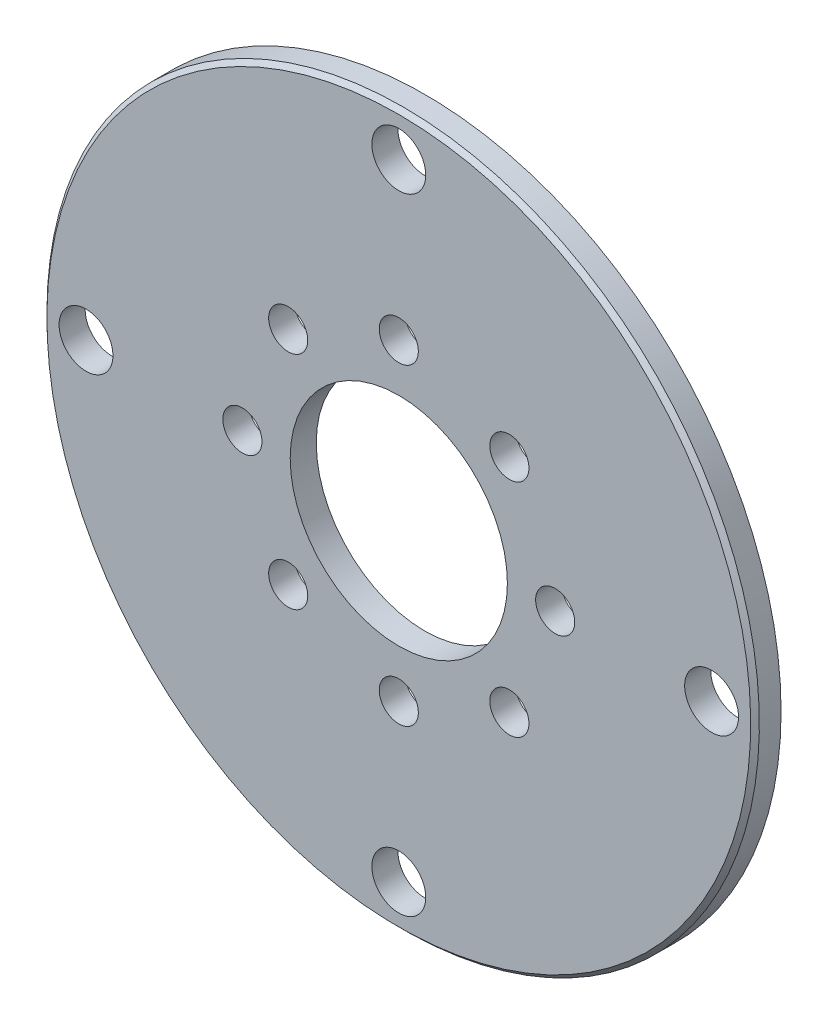
ISO-10303-21;
HEADER;
FILE_DESCRIPTION(('STEP AP214'),'2;1');
FILE_NAME('part.step','',(''),(''),'','','');
FILE_SCHEMA(('AUTOMOTIVE_DESIGN { 1 0 10303 214 1 1 1 1 }'));
ENDSEC;
DATA;
#1=APPLICATION_CONTEXT('core data for automotive mechanical design processes');
#2=APPLICATION_PROTOCOL_DEFINITION('international standard','automotive_design',2000,#1);
#3=PRODUCT_CONTEXT('',#1,'mechanical');
#4=PRODUCT('Part','Part','',(#3));
#5=PRODUCT_RELATED_PRODUCT_CATEGORY('part','',(#4));
#6=PRODUCT_DEFINITION_FORMATION('','',#4);
#7=PRODUCT_DEFINITION_CONTEXT('part definition',#1,'design');
#8=PRODUCT_DEFINITION('design','',#6,#7);
#9=PRODUCT_DEFINITION_SHAPE('','',#8);
#10=(LENGTH_UNIT() NAMED_UNIT(*) SI_UNIT(.MILLI.,.METRE.));
#11=(NAMED_UNIT(*) PLANE_ANGLE_UNIT() SI_UNIT($,.RADIAN.));
#12=(NAMED_UNIT(*) SI_UNIT($,.STERADIAN.) SOLID_ANGLE_UNIT());
#13=UNCERTAINTY_MEASURE_WITH_UNIT(LENGTH_MEASURE(1.E-05),#10,'distance_accuracy_value','');
#14=(GEOMETRIC_REPRESENTATION_CONTEXT(3) GLOBAL_UNCERTAINTY_ASSIGNED_CONTEXT((#13)) GLOBAL_UNIT_ASSIGNED_CONTEXT((#10,
#11,#12)) REPRESENTATION_CONTEXT('',''));
#15=CARTESIAN_POINT('',(0.,0.,0.));
#16=DIRECTION('',(0.,0.,1.));
#17=DIRECTION('',(1.,0.,0.));
#18=AXIS2_PLACEMENT_3D('',#15,#16,#17);
#19=CARTESIAN_POINT('',(-12.72792206136,-12.72792206136,-0.4650000000288));
#20=DIRECTION('',(0.,0.,1.));
#21=DIRECTION('',(-1.,0.,0.));
#22=AXIS2_PLACEMENT_3D('',#19,#20,#21);
#23=CYLINDRICAL_SURFACE('',#22,2.25);
#24=CARTESIAN_POINT('',(-12.72792206136,-12.72792206136,0.));
#25=DIRECTION('',(0.,0.,1.));
#26=DIRECTION('',(-1.,0.,0.));
#27=AXIS2_PLACEMENT_3D('',#24,#25,#26);
#28=CIRCLE('',#27,2.25);
#29=CARTESIAN_POINT('',(-10.47792206136,-12.72792206136,0.));
#30=VERTEX_POINT('',#29);
#31=EDGE_CURVE('E166',#30,#30,#28,.T.);
#32=ORIENTED_EDGE('',*,*,#31,.F.);
#33=DIRECTION('',(0.,0.,1.));
#34=VECTOR('',#33,1.);
#35=CARTESIAN_POINT('',(-10.47792206136,-12.72792206136,-0.4650000000288));
#36=LINE('',#35,#34);
#37=CARTESIAN_POINT('',(-10.47792206136,-12.72792206136,3.));
#38=VERTEX_POINT('',#37);
#39=EDGE_CURVE('E11',#30,#38,#36,.T.);
#40=ORIENTED_EDGE('',*,*,#39,.T.);
#41=CARTESIAN_POINT('',(-12.72792206136,-12.72792206136,3.));
#42=DIRECTION('',(0.,0.,1.));
#43=DIRECTION('',(-1.,0.,0.));
#44=AXIS2_PLACEMENT_3D('',#41,#42,#43);
#45=CIRCLE('',#44,2.25);
#46=EDGE_CURVE('E227',#38,#38,#45,.T.);
#47=ORIENTED_EDGE('',*,*,#46,.T.);
#48=ORIENTED_EDGE('',*,*,#39,.F.);
#49=EDGE_LOOP('',(#32,#40,#47,#48));
#50=FACE_BOUND('',#49,.T.);
#51=ADVANCED_FACE('F17',(#50),#23,.F.);
#52=CARTESIAN_POINT('',(0.,-18.,-0.4650000000288));
#53=DIRECTION('',(0.,0.,1.));
#54=DIRECTION('',(-1.,0.,0.));
#55=AXIS2_PLACEMENT_3D('',#52,#53,#54);
#56=CYLINDRICAL_SURFACE('',#55,2.25);
#57=CARTESIAN_POINT('',(0.,-18.,0.));
#58=DIRECTION('',(0.,0.,1.));
#59=DIRECTION('',(-1.,0.,0.));
#60=AXIS2_PLACEMENT_3D('',#57,#58,#59);
#61=CIRCLE('',#60,2.25);
#62=CARTESIAN_POINT('',(2.25,-18.,0.));
#63=VERTEX_POINT('',#62);
#64=EDGE_CURVE('E156',#63,#63,#61,.T.);
#65=ORIENTED_EDGE('',*,*,#64,.F.);
#66=DIRECTION('',(0.,0.,1.));
#67=VECTOR('',#66,1.);
#68=CARTESIAN_POINT('',(2.25,-18.,-0.4650000000288));
#69=LINE('',#68,#67);
#70=CARTESIAN_POINT('',(2.25,-18.,3.));
#71=VERTEX_POINT('',#70);
#72=EDGE_CURVE('E28',#63,#71,#69,.T.);
#73=ORIENTED_EDGE('',*,*,#72,.T.);
#74=CARTESIAN_POINT('',(0.,-18.,3.));
#75=DIRECTION('',(0.,0.,1.));
#76=DIRECTION('',(-1.,0.,0.));
#77=AXIS2_PLACEMENT_3D('',#74,#75,#76);
#78=CIRCLE('',#77,2.25);
#79=EDGE_CURVE('E158',#71,#71,#78,.T.);
#80=ORIENTED_EDGE('',*,*,#79,.T.);
#81=ORIENTED_EDGE('',*,*,#72,.F.);
#82=EDGE_LOOP('',(#65,#73,#80,#81));
#83=FACE_BOUND('',#82,.T.);
#84=ADVANCED_FACE('F155',(#83),#56,.F.);
#85=CARTESIAN_POINT('',(12.72792206136,-12.72792206136,-0.4650000000288));
#86=DIRECTION('',(0.,0.,1.));
#87=DIRECTION('',(-1.,0.,0.));
#88=AXIS2_PLACEMENT_3D('',#85,#86,#87);
#89=CYLINDRICAL_SURFACE('',#88,2.25);
#90=CARTESIAN_POINT('',(12.72792206136,-12.72792206136,0.));
#91=DIRECTION('',(0.,0.,1.));
#92=DIRECTION('',(-1.,0.,0.));
#93=AXIS2_PLACEMENT_3D('',#90,#91,#92);
#94=CIRCLE('',#93,2.25);
#95=CARTESIAN_POINT('',(14.97792206136,-12.72792206136,0.));
#96=VERTEX_POINT('',#95);
#97=EDGE_CURVE('E167',#96,#96,#94,.T.);
#98=ORIENTED_EDGE('',*,*,#97,.F.);
#99=DIRECTION('',(0.,0.,1.));
#100=VECTOR('',#99,1.);
#101=CARTESIAN_POINT('',(14.97792206136,-12.72792206136,-0.4650000000288));
#102=LINE('',#101,#100);
#103=CARTESIAN_POINT('',(14.97792206136,-12.72792206136,3.));
#104=VERTEX_POINT('',#103);
#105=EDGE_CURVE('E160',#96,#104,#102,.T.);
#106=ORIENTED_EDGE('',*,*,#105,.T.);
#107=CARTESIAN_POINT('',(12.72792206136,-12.72792206136,3.));
#108=DIRECTION('',(0.,0.,1.));
#109=DIRECTION('',(-1.,0.,0.));
#110=AXIS2_PLACEMENT_3D('',#107,#108,#109);
#111=CIRCLE('',#110,2.25);
#112=EDGE_CURVE('E274',#104,#104,#111,.T.);
#113=ORIENTED_EDGE('',*,*,#112,.T.);
#114=ORIENTED_EDGE('',*,*,#105,.F.);
#115=EDGE_LOOP('',(#98,#106,#113,#114));
#116=FACE_BOUND('',#115,.T.);
#117=ADVANCED_FACE('F369',(#116),#89,.F.);
#118=CARTESIAN_POINT('',(18.,0.,-0.4650000000288));
#119=DIRECTION('',(0.,0.,1.));
#120=DIRECTION('',(-1.,0.,0.));
#121=AXIS2_PLACEMENT_3D('',#118,#119,#120);
#122=CYLINDRICAL_SURFACE('',#121,2.25);
#123=CARTESIAN_POINT('',(18.,0.,0.));
#124=DIRECTION('',(0.,0.,1.));
#125=DIRECTION('',(-1.,0.,0.));
#126=AXIS2_PLACEMENT_3D('',#123,#124,#125);
#127=CIRCLE('',#126,2.25);
#128=CARTESIAN_POINT('',(20.25,0.,0.));
#129=VERTEX_POINT('',#128);
#130=EDGE_CURVE('E178',#129,#129,#127,.T.);
#131=ORIENTED_EDGE('',*,*,#130,.F.);
#132=DIRECTION('',(0.,0.,1.));
#133=VECTOR('',#132,1.);
#134=CARTESIAN_POINT('',(20.25,0.,-0.4650000000288));
#135=LINE('',#134,#133);
#136=CARTESIAN_POINT('',(20.25,0.,3.));
#137=VERTEX_POINT('',#136);
#138=EDGE_CURVE('E270',#129,#137,#135,.T.);
#139=ORIENTED_EDGE('',*,*,#138,.T.);
#140=CARTESIAN_POINT('',(18.,0.,3.));
#141=DIRECTION('',(0.,0.,1.));
#142=DIRECTION('',(-1.,0.,0.));
#143=AXIS2_PLACEMENT_3D('',#140,#141,#142);
#144=CIRCLE('',#143,2.25);
#145=EDGE_CURVE('E211',#137,#137,#144,.T.);
#146=ORIENTED_EDGE('',*,*,#145,.T.);
#147=ORIENTED_EDGE('',*,*,#138,.F.);
#148=EDGE_LOOP('',(#131,#139,#146,#147));
#149=FACE_BOUND('',#148,.T.);
#150=ADVANCED_FACE('F374',(#149),#122,.F.);
#151=CARTESIAN_POINT('',(12.72792206136,12.72792206136,-0.4650000000288));
#152=DIRECTION('',(0.,0.,1.));
#153=DIRECTION('',(-1.,0.,0.));
#154=AXIS2_PLACEMENT_3D('',#151,#152,#153);
#155=CYLINDRICAL_SURFACE('',#154,2.25);
#156=CARTESIAN_POINT('',(12.72792206136,12.72792206136,0.));
#157=DIRECTION('',(0.,0.,1.));
#158=DIRECTION('',(-1.,0.,0.));
#159=AXIS2_PLACEMENT_3D('',#156,#157,#158);
#160=CIRCLE('',#159,2.25);
#161=CARTESIAN_POINT('',(14.97792206136,12.72792206136,0.));
#162=VERTEX_POINT('',#161);
#163=EDGE_CURVE('E202',#162,#162,#160,.T.);
#164=ORIENTED_EDGE('',*,*,#163,.F.);
#165=DIRECTION('',(0.,0.,1.));
#166=VECTOR('',#165,1.);
#167=CARTESIAN_POINT('',(14.97792206136,12.72792206136,-0.4650000000288));
#168=LINE('',#167,#166);
#169=CARTESIAN_POINT('',(14.97792206136,12.72792206136,3.));
#170=VERTEX_POINT('',#169);
#171=EDGE_CURVE('E267',#162,#170,#168,.T.);
#172=ORIENTED_EDGE('',*,*,#171,.T.);
#173=CARTESIAN_POINT('',(12.72792206136,12.72792206136,3.));
#174=DIRECTION('',(0.,0.,1.));
#175=DIRECTION('',(-1.,0.,0.));
#176=AXIS2_PLACEMENT_3D('',#173,#174,#175);
#177=CIRCLE('',#176,2.25);
#178=EDGE_CURVE('E207',#170,#170,#177,.T.);
#179=ORIENTED_EDGE('',*,*,#178,.T.);
#180=ORIENTED_EDGE('',*,*,#171,.F.);
#181=EDGE_LOOP('',(#164,#172,#179,#180));
#182=FACE_BOUND('',#181,.T.);
#183=ADVANCED_FACE('F376',(#182),#155,.F.);
#184=CARTESIAN_POINT('',(0.,18.,-0.4650000000288));
#185=DIRECTION('',(0.,0.,1.));
#186=DIRECTION('',(-1.,0.,0.));
#187=AXIS2_PLACEMENT_3D('',#184,#185,#186);
#188=CYLINDRICAL_SURFACE('',#187,2.25);
#189=CARTESIAN_POINT('',(0.,18.,0.));
#190=DIRECTION('',(0.,0.,1.));
#191=DIRECTION('',(-1.,0.,0.));
#192=AXIS2_PLACEMENT_3D('',#189,#190,#191);
#193=CIRCLE('',#192,2.25);
#194=CARTESIAN_POINT('',(2.25,18.,0.));
#195=VERTEX_POINT('',#194);
#196=EDGE_CURVE('E206',#195,#195,#193,.T.);
#197=ORIENTED_EDGE('',*,*,#196,.F.);
#198=DIRECTION('',(0.,0.,1.));
#199=VECTOR('',#198,1.);
#200=CARTESIAN_POINT('',(2.25,18.,-0.4650000000288));
#201=LINE('',#200,#199);
#202=CARTESIAN_POINT('',(2.25,18.,3.));
#203=VERTEX_POINT('',#202);
#204=EDGE_CURVE('E271',#195,#203,#201,.T.);
#205=ORIENTED_EDGE('',*,*,#204,.T.);
#206=CARTESIAN_POINT('',(0.,18.,3.));
#207=DIRECTION('',(0.,0.,1.));
#208=DIRECTION('',(-1.,0.,0.));
#209=AXIS2_PLACEMENT_3D('',#206,#207,#208);
#210=CIRCLE('',#209,2.25);
#211=EDGE_CURVE('E212',#203,#203,#210,.T.);
#212=ORIENTED_EDGE('',*,*,#211,.T.);
#213=ORIENTED_EDGE('',*,*,#204,.F.);
#214=EDGE_LOOP('',(#197,#205,#212,#213));
#215=FACE_BOUND('',#214,.T.);
#216=ADVANCED_FACE('F379',(#215),#188,.F.);
#217=CARTESIAN_POINT('',(-12.72792206136,12.72792206136,-0.4650000000288));
#218=DIRECTION('',(0.,0.,1.));
#219=DIRECTION('',(-1.,0.,0.));
#220=AXIS2_PLACEMENT_3D('',#217,#218,#219);
#221=CYLINDRICAL_SURFACE('',#220,2.25);
#222=CARTESIAN_POINT('',(-12.72792206136,12.72792206136,0.));
#223=DIRECTION('',(0.,0.,1.));
#224=DIRECTION('',(-1.,0.,0.));
#225=AXIS2_PLACEMENT_3D('',#222,#223,#224);
#226=CIRCLE('',#225,2.25);
#227=CARTESIAN_POINT('',(-10.47792206136,12.72792206136,0.));
#228=VERTEX_POINT('',#227);
#229=EDGE_CURVE('E248',#228,#228,#226,.T.);
#230=ORIENTED_EDGE('',*,*,#229,.F.);
#231=DIRECTION('',(0.,0.,1.));
#232=VECTOR('',#231,1.);
#233=CARTESIAN_POINT('',(-10.47792206136,12.72792206136,-0.4650000000288));
#234=LINE('',#233,#232);
#235=CARTESIAN_POINT('',(-10.47792206136,12.72792206136,3.));
#236=VERTEX_POINT('',#235);
#237=EDGE_CURVE('E196',#228,#236,#234,.T.);
#238=ORIENTED_EDGE('',*,*,#237,.T.);
#239=CARTESIAN_POINT('',(-12.72792206136,12.72792206136,3.));
#240=DIRECTION('',(0.,0.,1.));
#241=DIRECTION('',(-1.,0.,0.));
#242=AXIS2_PLACEMENT_3D('',#239,#240,#241);
#243=CIRCLE('',#242,2.25);
#244=EDGE_CURVE('E284',#236,#236,#243,.T.);
#245=ORIENTED_EDGE('',*,*,#244,.T.);
#246=ORIENTED_EDGE('',*,*,#237,.F.);
#247=EDGE_LOOP('',(#230,#238,#245,#246));
#248=FACE_BOUND('',#247,.T.);
#249=ADVANCED_FACE('F384',(#248),#221,.F.);
#250=CARTESIAN_POINT('',(-18.,0.,-0.4650000000288));
#251=DIRECTION('',(0.,0.,1.));
#252=DIRECTION('',(-1.,0.,0.));
#253=AXIS2_PLACEMENT_3D('',#250,#251,#252);
#254=CYLINDRICAL_SURFACE('',#253,2.25);
#255=CARTESIAN_POINT('',(-18.,0.,0.));
#256=DIRECTION('',(0.,0.,1.));
#257=DIRECTION('',(-1.,0.,0.));
#258=AXIS2_PLACEMENT_3D('',#255,#256,#257);
#259=CIRCLE('',#258,2.25);
#260=CARTESIAN_POINT('',(-15.75,0.,0.));
#261=VERTEX_POINT('',#260);
#262=EDGE_CURVE('E225',#261,#261,#259,.T.);
#263=ORIENTED_EDGE('',*,*,#262,.F.);
#264=DIRECTION('',(0.,0.,1.));
#265=VECTOR('',#264,1.);
#266=CARTESIAN_POINT('',(-15.75,0.,-0.4650000000288));
#267=LINE('',#266,#265);
#268=CARTESIAN_POINT('',(-15.75,0.,3.));
#269=VERTEX_POINT('',#268);
#270=EDGE_CURVE('E193',#261,#269,#267,.T.);
#271=ORIENTED_EDGE('',*,*,#270,.T.);
#272=CARTESIAN_POINT('',(-18.,0.,3.));
#273=DIRECTION('',(0.,0.,1.));
#274=DIRECTION('',(-1.,0.,0.));
#275=AXIS2_PLACEMENT_3D('',#272,#273,#274);
#276=CIRCLE('',#275,2.25);
#277=EDGE_CURVE('E187',#269,#269,#276,.T.);
#278=ORIENTED_EDGE('',*,*,#277,.T.);
#279=ORIENTED_EDGE('',*,*,#270,.F.);
#280=EDGE_LOOP('',(#263,#271,#278,#279));
#281=FACE_BOUND('',#280,.T.);
#282=ADVANCED_FACE('F19',(#281),#254,.F.);
#283=CARTESIAN_POINT('',(0.,0.,3.));
#284=DIRECTION('',(0.,0.,-1.));
#285=DIRECTION('',(-1.,0.,0.));
#286=AXIS2_PLACEMENT_3D('',#283,#284,#285);
#287=CYLINDRICAL_SURFACE('',#286,12.5);
#288=CARTESIAN_POINT('',(0.,0.,3.));
#289=DIRECTION('',(0.,0.,-1.));
#290=DIRECTION('',(-1.,0.,0.));
#291=AXIS2_PLACEMENT_3D('',#288,#289,#290);
#292=CIRCLE('',#291,12.5);
#293=CARTESIAN_POINT('',(12.5,0.,3.));
#294=VERTEX_POINT('',#293);
#295=EDGE_CURVE('E183',#294,#294,#292,.T.);
#296=ORIENTED_EDGE('',*,*,#295,.F.);
#297=DIRECTION('',(0.,0.,-1.));
#298=VECTOR('',#297,1.);
#299=CARTESIAN_POINT('',(12.5,0.,3.));
#300=LINE('',#299,#298);
#301=CARTESIAN_POINT('',(12.5,0.,0.));
#302=VERTEX_POINT('',#301);
#303=EDGE_CURVE('E197',#294,#302,#300,.T.);
#304=ORIENTED_EDGE('',*,*,#303,.T.);
#305=CARTESIAN_POINT('',(0.,0.,0.));
#306=DIRECTION('',(0.,0.,-1.));
#307=DIRECTION('',(-1.,0.,0.));
#308=AXIS2_PLACEMENT_3D('',#305,#306,#307);
#309=CIRCLE('',#308,12.5);
#310=EDGE_CURVE('E221',#302,#302,#309,.T.);
#311=ORIENTED_EDGE('',*,*,#310,.T.);
#312=ORIENTED_EDGE('',*,*,#303,.F.);
#313=EDGE_LOOP('',(#296,#304,#311,#312));
#314=FACE_BOUND('',#313,.T.);
#315=ADVANCED_FACE('F415',(#314),#287,.F.);
#316=CARTESIAN_POINT('',(0.,-36.,3.));
#317=DIRECTION('',(0.,0.,-1.));
#318=DIRECTION('',(0.,1.,0.));
#319=AXIS2_PLACEMENT_3D('',#316,#317,#318);
#320=CYLINDRICAL_SURFACE('',#319,3.1);
#321=CARTESIAN_POINT('',(0.,-36.,3.));
#322=DIRECTION('',(0.,0.,-1.));
#323=DIRECTION('',(0.,1.,0.));
#324=AXIS2_PLACEMENT_3D('',#321,#322,#323);
#325=CIRCLE('',#324,3.1);
#326=CARTESIAN_POINT('',(0.,-39.1,3.));
#327=VERTEX_POINT('',#326);
#328=EDGE_CURVE('E192',#327,#327,#325,.T.);
#329=ORIENTED_EDGE('',*,*,#328,.F.);
#330=DIRECTION('',(0.,0.,-1.));
#331=VECTOR('',#330,1.);
#332=CARTESIAN_POINT('',(0.,-39.1,3.));
#333=LINE('',#332,#331);
#334=CARTESIAN_POINT('',(0.,-39.1,0.));
#335=VERTEX_POINT('',#334);
#336=EDGE_CURVE('E258',#327,#335,#333,.T.);
#337=ORIENTED_EDGE('',*,*,#336,.T.);
#338=CARTESIAN_POINT('',(0.,-36.,0.));
#339=DIRECTION('',(0.,0.,-1.));
#340=DIRECTION('',(0.,1.,0.));
#341=AXIS2_PLACEMENT_3D('',#338,#339,#340);
#342=CIRCLE('',#341,3.1);
#343=EDGE_CURVE('E226',#335,#335,#342,.T.);
#344=ORIENTED_EDGE('',*,*,#343,.T.);
#345=ORIENTED_EDGE('',*,*,#336,.F.);
#346=EDGE_LOOP('',(#329,#337,#344,#345));
#347=FACE_BOUND('',#346,.T.);
#348=ADVANCED_FACE('F408',(#347),#320,.F.);
#349=CARTESIAN_POINT('',(-36.,0.,3.));
#350=DIRECTION('',(0.,0.,-1.));
#351=DIRECTION('',(1.,0.,0.));
#352=AXIS2_PLACEMENT_3D('',#349,#350,#351);
#353=CYLINDRICAL_SURFACE('',#352,3.1);
#354=CARTESIAN_POINT('',(-36.,0.,3.));
#355=DIRECTION('',(0.,0.,-1.));
#356=DIRECTION('',(1.,0.,0.));
#357=AXIS2_PLACEMENT_3D('',#354,#355,#356);
#358=CIRCLE('',#357,3.1);
#359=CARTESIAN_POINT('',(-39.1,0.,3.));
#360=VERTEX_POINT('',#359);
#361=EDGE_CURVE('E198',#360,#360,#358,.T.);
#362=ORIENTED_EDGE('',*,*,#361,.F.);
#363=DIRECTION('',(0.,0.,-1.));
#364=VECTOR('',#363,1.);
#365=CARTESIAN_POINT('',(-39.1,0.,3.));
#366=LINE('',#365,#364);
#367=CARTESIAN_POINT('',(-39.1,0.,0.));
#368=VERTEX_POINT('',#367);
#369=EDGE_CURVE('E255',#360,#368,#366,.T.);
#370=ORIENTED_EDGE('',*,*,#369,.T.);
#371=CARTESIAN_POINT('',(-36.,0.,0.));
#372=DIRECTION('',(0.,0.,-1.));
#373=DIRECTION('',(1.,0.,0.));
#374=AXIS2_PLACEMENT_3D('',#371,#372,#373);
#375=CIRCLE('',#374,3.1);
#376=EDGE_CURVE('E266',#368,#368,#375,.T.);
#377=ORIENTED_EDGE('',*,*,#376,.T.);
#378=ORIENTED_EDGE('',*,*,#369,.F.);
#379=EDGE_LOOP('',(#362,#370,#377,#378));
#380=FACE_BOUND('',#379,.T.);
#381=ADVANCED_FACE('F405',(#380),#353,.F.);
#382=CARTESIAN_POINT('',(0.,36.,3.));
#383=DIRECTION('',(0.,0.,-1.));
#384=DIRECTION('',(0.,-1.,0.));
#385=AXIS2_PLACEMENT_3D('',#382,#383,#384);
#386=CYLINDRICAL_SURFACE('',#385,3.1);
#387=CARTESIAN_POINT('',(0.,36.,3.));
#388=DIRECTION('',(0.,0.,-1.));
#389=DIRECTION('',(0.,-1.,0.));
#390=AXIS2_PLACEMENT_3D('',#387,#388,#389);
#391=CIRCLE('',#390,3.1);
#392=CARTESIAN_POINT('',(0.,39.1,3.));
#393=VERTEX_POINT('',#392);
#394=EDGE_CURVE('E21',#393,#393,#391,.T.);
#395=ORIENTED_EDGE('',*,*,#394,.F.);
#396=DIRECTION('',(0.,0.,-1.));
#397=VECTOR('',#396,1.);
#398=CARTESIAN_POINT('',(0.,39.1,3.));
#399=LINE('',#398,#397);
#400=CARTESIAN_POINT('',(0.,39.1,0.));
#401=VERTEX_POINT('',#400);
#402=EDGE_CURVE('E252',#393,#401,#399,.T.);
#403=ORIENTED_EDGE('',*,*,#402,.T.);
#404=CARTESIAN_POINT('',(0.,36.,0.));
#405=DIRECTION('',(0.,0.,-1.));
#406=DIRECTION('',(0.,-1.,0.));
#407=AXIS2_PLACEMENT_3D('',#404,#405,#406);
#408=CIRCLE('',#407,3.1);
#409=EDGE_CURVE('E299',#401,#401,#408,.T.);
#410=ORIENTED_EDGE('',*,*,#409,.T.);
#411=ORIENTED_EDGE('',*,*,#402,.F.);
#412=EDGE_LOOP('',(#395,#403,#410,#411));
#413=FACE_BOUND('',#412,.T.);
#414=ADVANCED_FACE('F407',(#413),#386,.F.);
#415=CARTESIAN_POINT('',(36.,0.,3.));
#416=DIRECTION('',(0.,0.,-1.));
#417=DIRECTION('',(-1.,0.,0.));
#418=AXIS2_PLACEMENT_3D('',#415,#416,#417);
#419=CYLINDRICAL_SURFACE('',#418,3.1);
#420=CARTESIAN_POINT('',(36.,0.,3.));
#421=DIRECTION('',(0.,0.,-1.));
#422=DIRECTION('',(-1.,0.,0.));
#423=AXIS2_PLACEMENT_3D('',#420,#421,#422);
#424=CIRCLE('',#423,3.1);
#425=CARTESIAN_POINT('',(39.1,0.,3.));
#426=VERTEX_POINT('',#425);
#427=EDGE_CURVE('E188',#426,#426,#424,.T.);
#428=ORIENTED_EDGE('',*,*,#427,.F.);
#429=DIRECTION('',(0.,0.,-1.));
#430=VECTOR('',#429,1.);
#431=CARTESIAN_POINT('',(39.1,0.,3.));
#432=LINE('',#431,#430);
#433=CARTESIAN_POINT('',(39.1,0.,0.));
#434=VERTEX_POINT('',#433);
#435=EDGE_CURVE('E229',#426,#434,#432,.T.);
#436=ORIENTED_EDGE('',*,*,#435,.T.);
#437=CARTESIAN_POINT('',(36.,0.,0.));
#438=DIRECTION('',(0.,0.,-1.));
#439=DIRECTION('',(-1.,0.,0.));
#440=AXIS2_PLACEMENT_3D('',#437,#438,#439);
#441=CIRCLE('',#440,3.1);
#442=EDGE_CURVE('E262',#434,#434,#441,.T.);
#443=ORIENTED_EDGE('',*,*,#442,.T.);
#444=ORIENTED_EDGE('',*,*,#435,.F.);
#445=EDGE_LOOP('',(#428,#436,#443,#444));
#446=FACE_BOUND('',#445,.T.);
#447=ADVANCED_FACE('F338',(#446),#419,.F.);
#448=CARTESIAN_POINT('',(0.,0.,3.));
#449=DIRECTION('',(0.,0.,1.));
#450=DIRECTION('',(1.,0.,0.));
#451=AXIS2_PLACEMENT_3D('',#448,#449,#450);
#452=PLANE('',#451);
#453=ORIENTED_EDGE('',*,*,#46,.F.);
#454=EDGE_LOOP('',(#453));
#455=FACE_BOUND('',#454,.T.);
#456=ORIENTED_EDGE('',*,*,#79,.F.);
#457=EDGE_LOOP('',(#456));
#458=FACE_BOUND('',#457,.T.);
#459=ORIENTED_EDGE('',*,*,#112,.F.);
#460=EDGE_LOOP('',(#459));
#461=FACE_BOUND('',#460,.T.);
#462=ORIENTED_EDGE('',*,*,#145,.F.);
#463=EDGE_LOOP('',(#462));
#464=FACE_BOUND('',#463,.T.);
#465=ORIENTED_EDGE('',*,*,#178,.F.);
#466=EDGE_LOOP('',(#465));
#467=FACE_BOUND('',#466,.T.);
#468=ORIENTED_EDGE('',*,*,#211,.F.);
#469=EDGE_LOOP('',(#468));
#470=FACE_BOUND('',#469,.T.);
#471=ORIENTED_EDGE('',*,*,#244,.F.);
#472=EDGE_LOOP('',(#471));
#473=FACE_BOUND('',#472,.T.);
#474=ORIENTED_EDGE('',*,*,#277,.F.);
#475=EDGE_LOOP('',(#474));
#476=FACE_BOUND('',#475,.T.);
#477=ORIENTED_EDGE('',*,*,#295,.T.);
#478=EDGE_LOOP('',(#477));
#479=FACE_BOUND('',#478,.T.);
#480=ORIENTED_EDGE('',*,*,#427,.T.);
#481=EDGE_LOOP('',(#480));
#482=FACE_BOUND('',#481,.T.);
#483=ORIENTED_EDGE('',*,*,#328,.T.);
#484=EDGE_LOOP('',(#483));
#485=FACE_BOUND('',#484,.T.);
#486=ORIENTED_EDGE('',*,*,#361,.T.);
#487=EDGE_LOOP('',(#486));
#488=FACE_BOUND('',#487,.T.);
#489=ORIENTED_EDGE('',*,*,#394,.T.);
#490=EDGE_LOOP('',(#489));
#491=FACE_BOUND('',#490,.T.);
#492=CARTESIAN_POINT('',(0.,0.,3.));
#493=DIRECTION('',(0.,0.,1.));
#494=DIRECTION('',(1.,0.,0.));
#495=AXIS2_PLACEMENT_3D('',#492,#493,#494);
#496=CIRCLE('',#495,40.5);
#497=CARTESIAN_POINT('',(0.,40.4999999999985,2.99999999999851));
#498=VERTEX_POINT('',#497);
#499=EDGE_CURVE('E217',#498,#498,#496,.T.);
#500=ORIENTED_EDGE('',*,*,#499,.T.);
#501=EDGE_LOOP('',(#500));
#502=FACE_BOUND('',#501,.T.);
#503=ADVANCED_FACE('F334',(#455,#458,#461,#464,#467,#470,#473,#476,#479,#482,#485,#488,#491,
#502),#452,.T.);
#504=CARTESIAN_POINT('',(0.,0.,2.750000000137));
#505=DIRECTION('',(0.,0.,-1.));
#506=DIRECTION('',(0.,-1.,0.));
#507=AXIS2_PLACEMENT_3D('',#504,#505,#506);
#508=CONICAL_SURFACE('',#507,40.74999999986,0.785398163397448);
#509=CARTESIAN_POINT('',(0.,0.,2.5));
#510=DIRECTION('',(0.,0.,1.));
#511=DIRECTION('',(1.,0.,0.));
#512=AXIS2_PLACEMENT_3D('',#509,#510,#511);
#513=CIRCLE('',#512,41.);
#514=CARTESIAN_POINT('',(-41.,0.,2.5));
#515=VERTEX_POINT('',#514);
#516=CARTESIAN_POINT('',(0.,40.9999999999985,2.4999999999985));
#517=VERTEX_POINT('',#516);
#518=EDGE_CURVE('E175',#515,#517,#513,.T.);
#519=ORIENTED_EDGE('',*,*,#518,.T.);
#520=DIRECTION('',(0.,-0.707106781186548,0.707106781186548));
#521=VECTOR('',#520,1.);
#522=CARTESIAN_POINT('',(0.,40.74999999986,2.750000000137));
#523=LINE('',#522,#521);
#524=EDGE_CURVE('E220',#517,#498,#523,.T.);
#525=ORIENTED_EDGE('',*,*,#524,.T.);
#526=ORIENTED_EDGE('',*,*,#499,.F.);
#527=ORIENTED_EDGE('',*,*,#524,.F.);
#528=CARTESIAN_POINT('',(0.,0.,2.5));
#529=DIRECTION('',(0.,0.,1.));
#530=DIRECTION('',(1.,0.,0.));
#531=AXIS2_PLACEMENT_3D('',#528,#529,#530);
#532=CIRCLE('',#531,41.);
#533=EDGE_CURVE('E231',#517,#515,#532,.T.);
#534=ORIENTED_EDGE('',*,*,#533,.T.);
#535=EDGE_LOOP('',(#519,#525,#526,#527,#534));
#536=FACE_BOUND('',#535,.T.);
#537=ADVANCED_FACE('F337',(#536),#508,.T.);
#538=CARTESIAN_POINT('',(0.,0.,0.));
#539=DIRECTION('',(0.,0.,1.));
#540=DIRECTION('',(1.,0.,0.));
#541=AXIS2_PLACEMENT_3D('',#538,#539,#540);
#542=CYLINDRICAL_SURFACE('',#541,41.);
#543=ORIENTED_EDGE('',*,*,#518,.F.);
#544=DIRECTION('',(0.,0.,-1.));
#545=VECTOR('',#544,1.);
#546=CARTESIAN_POINT('',(-41.,0.,0.));
#547=LINE('',#546,#545);
#548=CARTESIAN_POINT('',(-41.,0.,0.));
#549=VERTEX_POINT('',#548);
#550=EDGE_CURVE('E216',#515,#549,#547,.T.);
#551=ORIENTED_EDGE('',*,*,#550,.T.);
#552=CARTESIAN_POINT('',(0.,0.,0.));
#553=DIRECTION('',(0.,0.,1.));
#554=DIRECTION('',(1.,0.,0.));
#555=AXIS2_PLACEMENT_3D('',#552,#553,#554);
#556=CIRCLE('',#555,41.);
#557=EDGE_CURVE('E259',#549,#549,#556,.T.);
#558=ORIENTED_EDGE('',*,*,#557,.T.);
#559=ORIENTED_EDGE('',*,*,#550,.F.);
#560=ORIENTED_EDGE('',*,*,#533,.F.);
#561=EDGE_LOOP('',(#543,#551,#558,#559,#560));
#562=FACE_BOUND('',#561,.T.);
#563=ADVANCED_FACE('F353',(#562),#542,.T.);
#564=CARTESIAN_POINT('',(0.,0.,0.));
#565=DIRECTION('',(0.,0.,1.));
#566=DIRECTION('',(1.,0.,0.));
#567=AXIS2_PLACEMENT_3D('',#564,#565,#566);
#568=PLANE('',#567);
#569=ORIENTED_EDGE('',*,*,#31,.T.);
#570=EDGE_LOOP('',(#569));
#571=FACE_BOUND('',#570,.T.);
#572=ORIENTED_EDGE('',*,*,#64,.T.);
#573=EDGE_LOOP('',(#572));
#574=FACE_BOUND('',#573,.T.);
#575=ORIENTED_EDGE('',*,*,#97,.T.);
#576=EDGE_LOOP('',(#575));
#577=FACE_BOUND('',#576,.T.);
#578=ORIENTED_EDGE('',*,*,#130,.T.);
#579=EDGE_LOOP('',(#578));
#580=FACE_BOUND('',#579,.T.);
#581=ORIENTED_EDGE('',*,*,#163,.T.);
#582=EDGE_LOOP('',(#581));
#583=FACE_BOUND('',#582,.T.);
#584=ORIENTED_EDGE('',*,*,#196,.T.);
#585=EDGE_LOOP('',(#584));
#586=FACE_BOUND('',#585,.T.);
#587=ORIENTED_EDGE('',*,*,#229,.T.);
#588=EDGE_LOOP('',(#587));
#589=FACE_BOUND('',#588,.T.);
#590=ORIENTED_EDGE('',*,*,#262,.T.);
#591=EDGE_LOOP('',(#590));
#592=FACE_BOUND('',#591,.T.);
#593=ORIENTED_EDGE('',*,*,#310,.F.);
#594=EDGE_LOOP('',(#593));
#595=FACE_BOUND('',#594,.T.);
#596=ORIENTED_EDGE('',*,*,#343,.F.);
#597=EDGE_LOOP('',(#596));
#598=FACE_BOUND('',#597,.T.);
#599=ORIENTED_EDGE('',*,*,#376,.F.);
#600=EDGE_LOOP('',(#599));
#601=FACE_BOUND('',#600,.T.);
#602=ORIENTED_EDGE('',*,*,#409,.F.);
#603=EDGE_LOOP('',(#602));
#604=FACE_BOUND('',#603,.T.);
#605=ORIENTED_EDGE('',*,*,#442,.F.);
#606=EDGE_LOOP('',(#605));
#607=FACE_BOUND('',#606,.T.);
#608=ORIENTED_EDGE('',*,*,#557,.F.);
#609=EDGE_LOOP('',(#608));
#610=FACE_BOUND('',#609,.T.);
#611=ADVANCED_FACE('F163',(#571,#574,#577,#580,#583,#586,#589,#592,#595,#598,#601,#604,#607,
#610),#568,.F.);
#612=CLOSED_SHELL('',(#51,#84,#117,#150,#183,#216,#249,#282,#315,#348,#381,#414,#447,#503,#537,
#563,#611));
#613=MANIFOLD_SOLID_BREP('B1',#612);
#614=ADVANCED_BREP_SHAPE_REPRESENTATION('',(#18,#613),#14);
#615=SHAPE_DEFINITION_REPRESENTATION(#9,#614);
ENDSEC;
END-ISO-10303-21;
